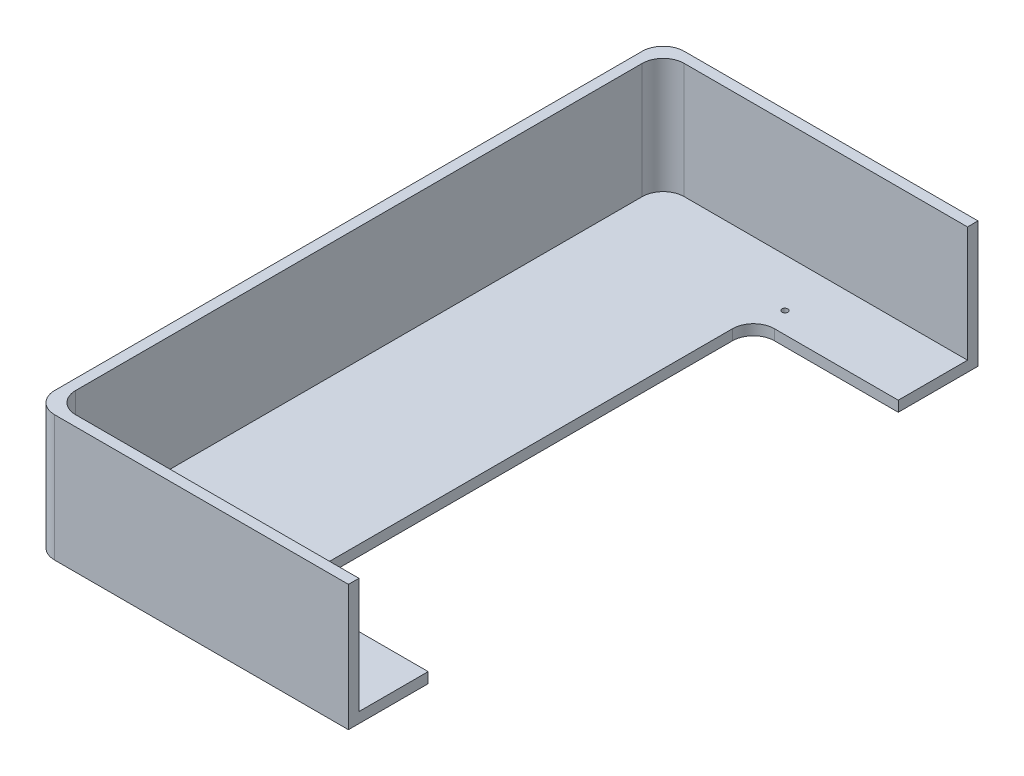
ISO-10303-21;
HEADER;
FILE_DESCRIPTION(('STEP AP214'),'2;1');
FILE_NAME('part.step','',(''),(''),'','','');
FILE_SCHEMA(('AUTOMOTIVE_DESIGN { 1 0 10303 214 1 1 1 1 }'));
ENDSEC;
DATA;
#1=APPLICATION_CONTEXT('core data for automotive mechanical design processes');
#2=APPLICATION_PROTOCOL_DEFINITION('international standard','automotive_design',2000,#1);
#3=PRODUCT_CONTEXT('',#1,'mechanical');
#4=PRODUCT('Part','Part','',(#3));
#5=PRODUCT_RELATED_PRODUCT_CATEGORY('part','',(#4));
#6=PRODUCT_DEFINITION_FORMATION('','',#4);
#7=PRODUCT_DEFINITION_CONTEXT('part definition',#1,'design');
#8=PRODUCT_DEFINITION('design','',#6,#7);
#9=PRODUCT_DEFINITION_SHAPE('','',#8);
#10=(LENGTH_UNIT() NAMED_UNIT(*) SI_UNIT(.MILLI.,.METRE.));
#11=(NAMED_UNIT(*) PLANE_ANGLE_UNIT() SI_UNIT($,.RADIAN.));
#12=(NAMED_UNIT(*) SI_UNIT($,.STERADIAN.) SOLID_ANGLE_UNIT());
#13=UNCERTAINTY_MEASURE_WITH_UNIT(LENGTH_MEASURE(1.E-05),#10,'distance_accuracy_value','');
#14=(GEOMETRIC_REPRESENTATION_CONTEXT(3) GLOBAL_UNCERTAINTY_ASSIGNED_CONTEXT((#13)) GLOBAL_UNIT_ASSIGNED_CONTEXT((#10,
#11,#12)) REPRESENTATION_CONTEXT('',''));
#15=CARTESIAN_POINT('',(0.,0.,0.));
#16=DIRECTION('',(0.,0.,1.));
#17=DIRECTION('',(1.,0.,0.));
#18=AXIS2_PLACEMENT_3D('',#15,#16,#17);
#19=CARTESIAN_POINT('',(0.,60.,0.));
#20=DIRECTION('',(-1.,0.,0.));
#21=DIRECTION('',(0.,0.,1.));
#22=AXIS2_PLACEMENT_3D('',#19,#20,#21);
#23=PLANE('',#22);
#24=DIRECTION('',(0.,0.,-1.));
#25=VECTOR('',#24,1.);
#26=CARTESIAN_POINT('',(0.,5.,5.));
#27=LINE('',#26,#25);
#28=CARTESIAN_POINT('',(0.,5.,38.));
#29=VERTEX_POINT('',#28);
#30=CARTESIAN_POINT('',(0.,5.,5.));
#31=VERTEX_POINT('',#30);
#32=EDGE_CURVE('E206',#29,#31,#27,.T.);
#33=ORIENTED_EDGE('',*,*,#32,.F.);
#34=DIRECTION('',(0.,1.,0.));
#35=VECTOR('',#34,1.);
#36=CARTESIAN_POINT('',(0.,-234.386433054475,38.));
#37=LINE('',#36,#35);
#38=CARTESIAN_POINT('',(0.,0.,38.));
#39=VERTEX_POINT('',#38);
#40=EDGE_CURVE('E196',#39,#29,#37,.T.);
#41=ORIENTED_EDGE('',*,*,#40,.F.);
#42=DIRECTION('',(0.,0.,-1.));
#43=VECTOR('',#42,1.);
#44=CARTESIAN_POINT('',(0.,0.,0.));
#45=LINE('',#44,#43);
#46=CARTESIAN_POINT('',(0.,0.,0.));
#47=VERTEX_POINT('',#46);
#48=EDGE_CURVE('E228',#39,#47,#45,.T.);
#49=ORIENTED_EDGE('',*,*,#48,.T.);
#50=DIRECTION('',(0.,-1.,0.));
#51=VECTOR('',#50,1.);
#52=CARTESIAN_POINT('',(0.,60.,0.));
#53=LINE('',#52,#51);
#54=CARTESIAN_POINT('',(0.,60.,0.));
#55=VERTEX_POINT('',#54);
#56=EDGE_CURVE('E259',#55,#47,#53,.T.);
#57=ORIENTED_EDGE('',*,*,#56,.F.);
#58=DIRECTION('',(0.,0.,-1.));
#59=VECTOR('',#58,1.);
#60=CARTESIAN_POINT('',(0.,60.,0.));
#61=LINE('',#60,#59);
#62=CARTESIAN_POINT('',(0.,60.,5.));
#63=VERTEX_POINT('',#62);
#64=EDGE_CURVE('E234',#63,#55,#61,.T.);
#65=ORIENTED_EDGE('',*,*,#64,.F.);
#66=DIRECTION('',(0.,1.,0.));
#67=VECTOR('',#66,1.);
#68=CARTESIAN_POINT('',(0.,-324.22985673747,5.));
#69=LINE('',#68,#67);
#70=EDGE_CURVE('E205',#31,#63,#69,.T.);
#71=ORIENTED_EDGE('',*,*,#70,.F.);
#72=EDGE_LOOP('',(#33,#41,#49,#57,#65,#71));
#73=FACE_BOUND('',#72,.T.);
#74=ADVANCED_FACE('F45',(#73),#23,.F.);
#75=CARTESIAN_POINT('',(0.,0.,300.));
#76=VERTEX_POINT('',#75);
#77=CARTESIAN_POINT('',(0.,0.,262.));
#78=VERTEX_POINT('',#77);
#79=EDGE_CURVE('E194',#76,#78,#45,.T.);
#80=ORIENTED_EDGE('',*,*,#79,.T.);
#81=DIRECTION('',(0.,1.,0.));
#82=VECTOR('',#81,1.);
#83=CARTESIAN_POINT('',(0.,-234.386433054475,262.));
#84=LINE('',#83,#82);
#85=CARTESIAN_POINT('',(0.,5.,262.));
#86=VERTEX_POINT('',#85);
#87=EDGE_CURVE('E177',#78,#86,#84,.T.);
#88=ORIENTED_EDGE('',*,*,#87,.T.);
#89=CARTESIAN_POINT('',(0.,5.,295.));
#90=VERTEX_POINT('',#89);
#91=EDGE_CURVE('E191',#90,#86,#27,.T.);
#92=ORIENTED_EDGE('',*,*,#91,.F.);
#93=DIRECTION('',(0.,1.,0.));
#94=VECTOR('',#93,1.);
#95=CARTESIAN_POINT('',(0.,-324.22985673747,295.));
#96=LINE('',#95,#94);
#97=CARTESIAN_POINT('',(0.,60.,295.));
#98=VERTEX_POINT('',#97);
#99=EDGE_CURVE('E219',#90,#98,#96,.T.);
#100=ORIENTED_EDGE('',*,*,#99,.T.);
#101=CARTESIAN_POINT('',(0.,60.,300.));
#102=VERTEX_POINT('',#101);
#103=EDGE_CURVE('E229',#102,#98,#61,.T.);
#104=ORIENTED_EDGE('',*,*,#103,.F.);
#105=DIRECTION('',(0.,-1.,0.));
#106=VECTOR('',#105,1.);
#107=CARTESIAN_POINT('',(0.,60.,300.));
#108=LINE('',#107,#106);
#109=EDGE_CURVE('E244',#102,#76,#108,.T.);
#110=ORIENTED_EDGE('',*,*,#109,.T.);
#111=EDGE_LOOP('',(#80,#88,#92,#100,#104,#110));
#112=FACE_BOUND('',#111,.T.);
#113=ADVANCED_FACE('F189',(#112),#23,.F.);
#114=CARTESIAN_POINT('',(0.,60.,0.));
#115=DIRECTION('',(0.,0.,1.));
#116=DIRECTION('',(1.,0.,0.));
#117=AXIS2_PLACEMENT_3D('',#114,#115,#116);
#118=PLANE('',#117);
#119=DIRECTION('',(-1.,0.,0.));
#120=VECTOR('',#119,1.);
#121=CARTESIAN_POINT('',(0.,0.,0.));
#122=LINE('',#121,#120);
#123=CARTESIAN_POINT('',(-140.,0.,0.));
#124=VERTEX_POINT('',#123);
#125=EDGE_CURVE('E247',#47,#124,#122,.T.);
#126=ORIENTED_EDGE('',*,*,#125,.T.);
#127=DIRECTION('',(0.,-1.,0.));
#128=VECTOR('',#127,1.);
#129=CARTESIAN_POINT('',(-140.,60.,0.));
#130=LINE('',#129,#128);
#131=CARTESIAN_POINT('',(-140.,60.,0.));
#132=VERTEX_POINT('',#131);
#133=EDGE_CURVE('E61',#124,#132,#130,.F.);
#134=ORIENTED_EDGE('',*,*,#133,.T.);
#135=DIRECTION('',(-1.,0.,0.));
#136=VECTOR('',#135,1.);
#137=CARTESIAN_POINT('',(0.,60.,0.));
#138=LINE('',#137,#136);
#139=EDGE_CURVE('E233',#55,#132,#138,.T.);
#140=ORIENTED_EDGE('',*,*,#139,.F.);
#141=ORIENTED_EDGE('',*,*,#56,.T.);
#142=EDGE_LOOP('',(#126,#134,#140,#141));
#143=FACE_BOUND('',#142,.T.);
#144=ADVANCED_FACE('F429',(#143),#118,.F.);
#145=CARTESIAN_POINT('',(-150.,60.,0.));
#146=DIRECTION('',(1.,0.,0.));
#147=DIRECTION('',(0.,0.,-1.));
#148=AXIS2_PLACEMENT_3D('',#145,#146,#147);
#149=PLANE('',#148);
#150=DIRECTION('',(0.,0.,1.));
#151=VECTOR('',#150,1.);
#152=CARTESIAN_POINT('',(-150.,0.,0.));
#153=LINE('',#152,#151);
#154=CARTESIAN_POINT('',(-150.,0.,10.));
#155=VERTEX_POINT('',#154);
#156=CARTESIAN_POINT('',(-150.,0.,290.));
#157=VERTEX_POINT('',#156);
#158=EDGE_CURVE('E250',#155,#157,#153,.T.);
#159=ORIENTED_EDGE('',*,*,#158,.T.);
#160=DIRECTION('',(0.,-1.,0.));
#161=VECTOR('',#160,1.);
#162=CARTESIAN_POINT('',(-150.,60.,290.));
#163=LINE('',#162,#161);
#164=CARTESIAN_POINT('',(-150.,60.,290.));
#165=VERTEX_POINT('',#164);
#166=EDGE_CURVE('E303',#157,#165,#163,.F.);
#167=ORIENTED_EDGE('',*,*,#166,.T.);
#168=DIRECTION('',(0.,0.,1.));
#169=VECTOR('',#168,1.);
#170=CARTESIAN_POINT('',(-150.,60.,0.));
#171=LINE('',#170,#169);
#172=CARTESIAN_POINT('',(-150.,60.,10.));
#173=VERTEX_POINT('',#172);
#174=EDGE_CURVE('E237',#173,#165,#171,.T.);
#175=ORIENTED_EDGE('',*,*,#174,.F.);
#176=DIRECTION('',(0.,-1.,0.));
#177=VECTOR('',#176,1.);
#178=CARTESIAN_POINT('',(-150.,60.,10.));
#179=LINE('',#178,#177);
#180=EDGE_CURVE('E299',#173,#155,#179,.T.);
#181=ORIENTED_EDGE('',*,*,#180,.T.);
#182=EDGE_LOOP('',(#159,#167,#175,#181));
#183=FACE_BOUND('',#182,.T.);
#184=ADVANCED_FACE('F433',(#183),#149,.F.);
#185=CARTESIAN_POINT('',(0.,60.,300.));
#186=DIRECTION('',(0.,0.,-1.));
#187=DIRECTION('',(-1.,0.,0.));
#188=AXIS2_PLACEMENT_3D('',#185,#186,#187);
#189=PLANE('',#188);
#190=DIRECTION('',(1.,0.,0.));
#191=VECTOR('',#190,1.);
#192=CARTESIAN_POINT('',(0.,60.,300.));
#193=LINE('',#192,#191);
#194=CARTESIAN_POINT('',(-140.,60.,300.));
#195=VERTEX_POINT('',#194);
#196=EDGE_CURVE('E241',#195,#102,#193,.T.);
#197=ORIENTED_EDGE('',*,*,#196,.F.);
#198=DIRECTION('',(0.,-1.,0.));
#199=VECTOR('',#198,1.);
#200=CARTESIAN_POINT('',(-140.,60.,300.));
#201=LINE('',#200,#199);
#202=CARTESIAN_POINT('',(-140.,0.,300.));
#203=VERTEX_POINT('',#202);
#204=EDGE_CURVE('E289',#195,#203,#201,.T.);
#205=ORIENTED_EDGE('',*,*,#204,.T.);
#206=DIRECTION('',(1.,0.,0.));
#207=VECTOR('',#206,1.);
#208=CARTESIAN_POINT('',(0.,0.,300.));
#209=LINE('',#208,#207);
#210=EDGE_CURVE('E254',#203,#76,#209,.T.);
#211=ORIENTED_EDGE('',*,*,#210,.T.);
#212=ORIENTED_EDGE('',*,*,#109,.F.);
#213=EDGE_LOOP('',(#197,#205,#211,#212));
#214=FACE_BOUND('',#213,.T.);
#215=ADVANCED_FACE('F408',(#214),#189,.F.);
#216=CARTESIAN_POINT('',(0.,60.,0.));
#217=DIRECTION('',(0.,-1.,0.));
#218=DIRECTION('',(0.,0.,-1.));
#219=AXIS2_PLACEMENT_3D('',#216,#217,#218);
#220=PLANE('',#219);
#221=ORIENTED_EDGE('',*,*,#174,.T.);
#222=CARTESIAN_POINT('',(-140.,60.,290.));
#223=DIRECTION('',(0.,-1.,0.));
#224=DIRECTION('',(0.,0.,-1.));
#225=AXIS2_PLACEMENT_3D('',#222,#223,#224);
#226=CIRCLE('',#225,10.);
#227=EDGE_CURVE('E309',#165,#195,#226,.F.);
#228=ORIENTED_EDGE('',*,*,#227,.T.);
#229=ORIENTED_EDGE('',*,*,#196,.T.);
#230=ORIENTED_EDGE('',*,*,#103,.T.);
#231=DIRECTION('',(1.,0.,0.));
#232=VECTOR('',#231,1.);
#233=CARTESIAN_POINT('',(-145.,60.,295.));
#234=LINE('',#233,#232);
#235=CARTESIAN_POINT('',(-135.,60.,295.));
#236=VERTEX_POINT('',#235);
#237=EDGE_CURVE('E376',#236,#98,#234,.T.);
#238=ORIENTED_EDGE('',*,*,#237,.F.);
#239=CARTESIAN_POINT('',(-135.,60.,285.));
#240=DIRECTION('',(0.,-1.,0.));
#241=DIRECTION('',(0.,0.,-1.));
#242=AXIS2_PLACEMENT_3D('',#239,#240,#241);
#243=CIRCLE('',#242,10.);
#244=CARTESIAN_POINT('',(-145.,60.,285.));
#245=VERTEX_POINT('',#244);
#246=EDGE_CURVE('E326',#236,#245,#243,.T.);
#247=ORIENTED_EDGE('',*,*,#246,.T.);
#248=DIRECTION('',(0.,0.,1.));
#249=VECTOR('',#248,1.);
#250=CARTESIAN_POINT('',(-145.,60.,5.));
#251=LINE('',#250,#249);
#252=CARTESIAN_POINT('',(-145.,60.,15.));
#253=VERTEX_POINT('',#252);
#254=EDGE_CURVE('E212',#253,#245,#251,.T.);
#255=ORIENTED_EDGE('',*,*,#254,.F.);
#256=CARTESIAN_POINT('',(-135.,60.,15.));
#257=DIRECTION('',(0.,-1.,0.));
#258=DIRECTION('',(0.,0.,-1.));
#259=AXIS2_PLACEMENT_3D('',#256,#257,#258);
#260=CIRCLE('',#259,10.);
#261=CARTESIAN_POINT('',(-135.,60.,5.));
#262=VERTEX_POINT('',#261);
#263=EDGE_CURVE('E12',#253,#262,#260,.T.);
#264=ORIENTED_EDGE('',*,*,#263,.T.);
#265=DIRECTION('',(-1.,0.,0.));
#266=VECTOR('',#265,1.);
#267=CARTESIAN_POINT('',(-5.,60.,5.));
#268=LINE('',#267,#266);
#269=EDGE_CURVE('E215',#63,#262,#268,.T.);
#270=ORIENTED_EDGE('',*,*,#269,.F.);
#271=ORIENTED_EDGE('',*,*,#64,.T.);
#272=ORIENTED_EDGE('',*,*,#139,.T.);
#273=CARTESIAN_POINT('',(-140.,60.,10.));
#274=DIRECTION('',(0.,-1.,0.));
#275=DIRECTION('',(0.,0.,-1.));
#276=AXIS2_PLACEMENT_3D('',#273,#274,#275);
#277=CIRCLE('',#276,10.);
#278=EDGE_CURVE('E306',#132,#173,#277,.F.);
#279=ORIENTED_EDGE('',*,*,#278,.T.);
#280=EDGE_LOOP('',(#221,#228,#229,#230,#238,#247,#255,#264,#270,#271,#272,#279));
#281=FACE_BOUND('',#280,.T.);
#282=ADVANCED_FACE('F402',(#281),#220,.F.);
#283=CARTESIAN_POINT('',(0.,0.,0.));
#284=DIRECTION('',(0.,-1.,0.));
#285=DIRECTION('',(0.,0.,-1.));
#286=AXIS2_PLACEMENT_3D('',#283,#284,#285);
#287=PLANE('',#286);
#288=CARTESIAN_POINT('',(-64.,0.,28.));
#289=DIRECTION('',(0.,-1.,0.));
#290=DIRECTION('',(0.,0.,-1.));
#291=AXIS2_PLACEMENT_3D('',#288,#289,#290);
#292=CIRCLE('',#291,1.4);
#293=CARTESIAN_POINT('',(-64.,0.,26.6));
#294=VERTEX_POINT('',#293);
#295=EDGE_CURVE('E361',#294,#294,#292,.F.);
#296=ORIENTED_EDGE('',*,*,#295,.T.);
#297=EDGE_LOOP('',(#296));
#298=FACE_BOUND('',#297,.T.);
#299=CARTESIAN_POINT('',(-64.,0.,272.));
#300=DIRECTION('',(0.,-1.,0.));
#301=DIRECTION('',(0.,0.,-1.));
#302=AXIS2_PLACEMENT_3D('',#299,#300,#301);
#303=CIRCLE('',#302,1.40000000000002);
#304=CARTESIAN_POINT('',(-64.,0.,270.6));
#305=VERTEX_POINT('',#304);
#306=EDGE_CURVE('E469',#305,#305,#303,.F.);
#307=ORIENTED_EDGE('',*,*,#306,.T.);
#308=EDGE_LOOP('',(#307));
#309=FACE_BOUND('',#308,.T.);
#310=ORIENTED_EDGE('',*,*,#210,.F.);
#311=CARTESIAN_POINT('',(-140.,0.,290.));
#312=DIRECTION('',(0.,-1.,0.));
#313=DIRECTION('',(0.,0.,-1.));
#314=AXIS2_PLACEMENT_3D('',#311,#312,#313);
#315=CIRCLE('',#314,10.);
#316=EDGE_CURVE('E296',#203,#157,#315,.T.);
#317=ORIENTED_EDGE('',*,*,#316,.T.);
#318=ORIENTED_EDGE('',*,*,#158,.F.);
#319=CARTESIAN_POINT('',(-140.,0.,10.));
#320=DIRECTION('',(0.,-1.,0.));
#321=DIRECTION('',(0.,0.,-1.));
#322=AXIS2_PLACEMENT_3D('',#319,#320,#321);
#323=CIRCLE('',#322,10.);
#324=EDGE_CURVE('E293',#155,#124,#323,.T.);
#325=ORIENTED_EDGE('',*,*,#324,.T.);
#326=ORIENTED_EDGE('',*,*,#125,.F.);
#327=ORIENTED_EDGE('',*,*,#48,.F.);
#328=DIRECTION('',(-1.,0.,0.));
#329=VECTOR('',#328,1.);
#330=CARTESIAN_POINT('',(0.,0.,38.));
#331=LINE('',#330,#329);
#332=CARTESIAN_POINT('',(-59.,0.,38.));
#333=VERTEX_POINT('',#332);
#334=EDGE_CURVE('E184',#39,#333,#331,.T.);
#335=ORIENTED_EDGE('',*,*,#334,.T.);
#336=CARTESIAN_POINT('',(-59.,0.,48.));
#337=DIRECTION('',(0.,-1.,0.));
#338=DIRECTION('',(0.,0.,-1.));
#339=AXIS2_PLACEMENT_3D('',#336,#337,#338);
#340=CIRCLE('',#339,10.);
#341=CARTESIAN_POINT('',(-69.,0.,48.));
#342=VERTEX_POINT('',#341);
#343=EDGE_CURVE('E54',#333,#342,#340,.F.);
#344=ORIENTED_EDGE('',*,*,#343,.T.);
#345=DIRECTION('',(0.,0.,1.));
#346=VECTOR('',#345,1.);
#347=CARTESIAN_POINT('',(-69.,0.,38.));
#348=LINE('',#347,#346);
#349=CARTESIAN_POINT('',(-69.,0.,252.));
#350=VERTEX_POINT('',#349);
#351=EDGE_CURVE('E339',#342,#350,#348,.T.);
#352=ORIENTED_EDGE('',*,*,#351,.T.);
#353=CARTESIAN_POINT('',(-59.,0.,252.));
#354=DIRECTION('',(0.,-1.,0.));
#355=DIRECTION('',(0.,0.,-1.));
#356=AXIS2_PLACEMENT_3D('',#353,#354,#355);
#357=CIRCLE('',#356,10.);
#358=CARTESIAN_POINT('',(-59.,0.,262.));
#359=VERTEX_POINT('',#358);
#360=EDGE_CURVE('E323',#350,#359,#357,.F.);
#361=ORIENTED_EDGE('',*,*,#360,.T.);
#362=DIRECTION('',(1.,0.,0.));
#363=VECTOR('',#362,1.);
#364=CARTESIAN_POINT('',(0.,0.,262.));
#365=LINE('',#364,#363);
#366=EDGE_CURVE('E197',#359,#78,#365,.T.);
#367=ORIENTED_EDGE('',*,*,#366,.T.);
#368=ORIENTED_EDGE('',*,*,#79,.F.);
#369=EDGE_LOOP('',(#310,#317,#318,#325,#326,#327,#335,#344,#352,#361,#367,#368));
#370=FACE_BOUND('',#369,.T.);
#371=ADVANCED_FACE('F338',(#298,#309,#370),#287,.T.);
#372=CARTESIAN_POINT('',(0.,5.,0.));
#373=DIRECTION('',(0.,-1.,0.));
#374=DIRECTION('',(0.,0.,-1.));
#375=AXIS2_PLACEMENT_3D('',#372,#373,#374);
#376=PLANE('',#375);
#377=CARTESIAN_POINT('',(-64.,5.,28.));
#378=DIRECTION('',(0.,1.,0.));
#379=DIRECTION('',(0.,0.,1.));
#380=AXIS2_PLACEMENT_3D('',#377,#378,#379);
#381=CIRCLE('',#380,1.4);
#382=CARTESIAN_POINT('',(-64.,5.,29.4));
#383=VERTEX_POINT('',#382);
#384=EDGE_CURVE('E367',#383,#383,#381,.T.);
#385=ORIENTED_EDGE('',*,*,#384,.F.);
#386=EDGE_LOOP('',(#385));
#387=FACE_BOUND('',#386,.T.);
#388=CARTESIAN_POINT('',(-64.,5.,272.));
#389=DIRECTION('',(0.,1.,0.));
#390=DIRECTION('',(0.,0.,-1.));
#391=AXIS2_PLACEMENT_3D('',#388,#389,#390);
#392=CIRCLE('',#391,1.40000000000002);
#393=CARTESIAN_POINT('',(-64.,5.,270.6));
#394=VERTEX_POINT('',#393);
#395=EDGE_CURVE('E466',#394,#394,#392,.T.);
#396=ORIENTED_EDGE('',*,*,#395,.F.);
#397=EDGE_LOOP('',(#396));
#398=FACE_BOUND('',#397,.T.);
#399=DIRECTION('',(0.,0.,1.));
#400=VECTOR('',#399,1.);
#401=CARTESIAN_POINT('',(-145.,5.,5.));
#402=LINE('',#401,#400);
#403=CARTESIAN_POINT('',(-145.,5.,15.));
#404=VERTEX_POINT('',#403);
#405=CARTESIAN_POINT('',(-145.,5.,285.));
#406=VERTEX_POINT('',#405);
#407=EDGE_CURVE('E220',#404,#406,#402,.T.);
#408=ORIENTED_EDGE('',*,*,#407,.T.);
#409=CARTESIAN_POINT('',(-135.,5.,285.));
#410=DIRECTION('',(0.,-1.,0.));
#411=DIRECTION('',(0.,0.,-1.));
#412=AXIS2_PLACEMENT_3D('',#409,#410,#411);
#413=CIRCLE('',#412,10.);
#414=CARTESIAN_POINT('',(-135.,5.,295.));
#415=VERTEX_POINT('',#414);
#416=EDGE_CURVE('E286',#406,#415,#413,.F.);
#417=ORIENTED_EDGE('',*,*,#416,.T.);
#418=DIRECTION('',(1.,0.,0.));
#419=VECTOR('',#418,1.);
#420=CARTESIAN_POINT('',(-145.,5.,295.));
#421=LINE('',#420,#419);
#422=EDGE_CURVE('E202',#415,#90,#421,.T.);
#423=ORIENTED_EDGE('',*,*,#422,.T.);
#424=ORIENTED_EDGE('',*,*,#91,.T.);
#425=DIRECTION('',(1.,0.,0.));
#426=VECTOR('',#425,1.);
#427=CARTESIAN_POINT('',(0.,5.,262.));
#428=LINE('',#427,#426);
#429=CARTESIAN_POINT('',(-59.,5.,262.));
#430=VERTEX_POINT('',#429);
#431=EDGE_CURVE('E173',#430,#86,#428,.T.);
#432=ORIENTED_EDGE('',*,*,#431,.F.);
#433=CARTESIAN_POINT('',(-59.,5.,252.));
#434=DIRECTION('',(0.,-1.,0.));
#435=DIRECTION('',(0.,0.,-1.));
#436=AXIS2_PLACEMENT_3D('',#433,#434,#435);
#437=CIRCLE('',#436,10.);
#438=CARTESIAN_POINT('',(-69.,5.,252.));
#439=VERTEX_POINT('',#438);
#440=EDGE_CURVE('E320',#430,#439,#437,.T.);
#441=ORIENTED_EDGE('',*,*,#440,.T.);
#442=DIRECTION('',(0.,0.,1.));
#443=VECTOR('',#442,1.);
#444=CARTESIAN_POINT('',(-69.,5.,38.));
#445=LINE('',#444,#443);
#446=CARTESIAN_POINT('',(-69.,5.,48.));
#447=VERTEX_POINT('',#446);
#448=EDGE_CURVE('E185',#447,#439,#445,.T.);
#449=ORIENTED_EDGE('',*,*,#448,.F.);
#450=CARTESIAN_POINT('',(-59.,5.,48.));
#451=DIRECTION('',(0.,-1.,0.));
#452=DIRECTION('',(0.,0.,-1.));
#453=AXIS2_PLACEMENT_3D('',#450,#451,#452);
#454=CIRCLE('',#453,10.);
#455=CARTESIAN_POINT('',(-59.,5.,38.));
#456=VERTEX_POINT('',#455);
#457=EDGE_CURVE('E329',#447,#456,#454,.T.);
#458=ORIENTED_EDGE('',*,*,#457,.T.);
#459=DIRECTION('',(-1.,0.,0.));
#460=VECTOR('',#459,1.);
#461=CARTESIAN_POINT('',(0.,5.,38.));
#462=LINE('',#461,#460);
#463=EDGE_CURVE('E355',#29,#456,#462,.T.);
#464=ORIENTED_EDGE('',*,*,#463,.F.);
#465=ORIENTED_EDGE('',*,*,#32,.T.);
#466=DIRECTION('',(-1.,0.,0.));
#467=VECTOR('',#466,1.);
#468=CARTESIAN_POINT('',(-5.,5.,5.));
#469=LINE('',#468,#467);
#470=CARTESIAN_POINT('',(-135.,5.,5.));
#471=VERTEX_POINT('',#470);
#472=EDGE_CURVE('E210',#31,#471,#469,.T.);
#473=ORIENTED_EDGE('',*,*,#472,.T.);
#474=CARTESIAN_POINT('',(-135.,5.,15.));
#475=DIRECTION('',(0.,-1.,0.));
#476=DIRECTION('',(0.,0.,-1.));
#477=AXIS2_PLACEMENT_3D('',#474,#475,#476);
#478=CIRCLE('',#477,10.);
#479=EDGE_CURVE('E283',#471,#404,#478,.F.);
#480=ORIENTED_EDGE('',*,*,#479,.T.);
#481=EDGE_LOOP('',(#408,#417,#423,#424,#432,#441,#449,#458,#464,#465,#473,#480));
#482=FACE_BOUND('',#481,.T.);
#483=ADVANCED_FACE('F200',(#387,#398,#482),#376,.F.);
#484=CARTESIAN_POINT('',(-5.,-324.22985673747,5.));
#485=DIRECTION('',(0.,0.,-1.));
#486=DIRECTION('',(-1.,0.,0.));
#487=AXIS2_PLACEMENT_3D('',#484,#485,#486);
#488=PLANE('',#487);
#489=ORIENTED_EDGE('',*,*,#269,.T.);
#490=DIRECTION('',(0.,1.,0.));
#491=VECTOR('',#490,1.);
#492=CARTESIAN_POINT('',(-135.,5.,5.));
#493=LINE('',#492,#491);
#494=EDGE_CURVE('E317',#262,#471,#493,.F.);
#495=ORIENTED_EDGE('',*,*,#494,.T.);
#496=ORIENTED_EDGE('',*,*,#472,.F.);
#497=ORIENTED_EDGE('',*,*,#70,.T.);
#498=EDGE_LOOP('',(#489,#495,#496,#497));
#499=FACE_BOUND('',#498,.T.);
#500=ADVANCED_FACE('F385',(#499),#488,.F.);
#501=CARTESIAN_POINT('',(-145.,-324.22985673747,5.));
#502=DIRECTION('',(-1.,0.,0.));
#503=DIRECTION('',(0.,0.,1.));
#504=AXIS2_PLACEMENT_3D('',#501,#502,#503);
#505=PLANE('',#504);
#506=ORIENTED_EDGE('',*,*,#254,.T.);
#507=DIRECTION('',(0.,1.,0.));
#508=VECTOR('',#507,1.);
#509=CARTESIAN_POINT('',(-145.,5.,285.));
#510=LINE('',#509,#508);
#511=EDGE_CURVE('E280',#245,#406,#510,.F.);
#512=ORIENTED_EDGE('',*,*,#511,.T.);
#513=ORIENTED_EDGE('',*,*,#407,.F.);
#514=DIRECTION('',(0.,1.,0.));
#515=VECTOR('',#514,1.);
#516=CARTESIAN_POINT('',(-145.,60.,15.));
#517=LINE('',#516,#515);
#518=EDGE_CURVE('E276',#404,#253,#517,.T.);
#519=ORIENTED_EDGE('',*,*,#518,.T.);
#520=EDGE_LOOP('',(#506,#512,#513,#519));
#521=FACE_BOUND('',#520,.T.);
#522=ADVANCED_FACE('F394',(#521),#505,.F.);
#523=CARTESIAN_POINT('',(-145.,-324.22985673747,295.));
#524=DIRECTION('',(0.,0.,1.));
#525=DIRECTION('',(1.,0.,0.));
#526=AXIS2_PLACEMENT_3D('',#523,#524,#525);
#527=PLANE('',#526);
#528=ORIENTED_EDGE('',*,*,#422,.F.);
#529=DIRECTION('',(0.,1.,0.));
#530=VECTOR('',#529,1.);
#531=CARTESIAN_POINT('',(-135.,60.,295.));
#532=LINE('',#531,#530);
#533=EDGE_CURVE('E272',#415,#236,#532,.T.);
#534=ORIENTED_EDGE('',*,*,#533,.T.);
#535=ORIENTED_EDGE('',*,*,#237,.T.);
#536=ORIENTED_EDGE('',*,*,#99,.F.);
#537=EDGE_LOOP('',(#528,#534,#535,#536));
#538=FACE_BOUND('',#537,.T.);
#539=ADVANCED_FACE('F399',(#538),#527,.F.);
#540=CARTESIAN_POINT('',(0.,-234.386433054475,38.));
#541=DIRECTION('',(0.,0.,-1.));
#542=DIRECTION('',(-1.,0.,0.));
#543=AXIS2_PLACEMENT_3D('',#540,#541,#542);
#544=PLANE('',#543);
#545=ORIENTED_EDGE('',*,*,#463,.T.);
#546=DIRECTION('',(0.,1.,0.));
#547=VECTOR('',#546,1.);
#548=CARTESIAN_POINT('',(-59.,0.,38.));
#549=LINE('',#548,#547);
#550=EDGE_CURVE('E312',#456,#333,#549,.F.);
#551=ORIENTED_EDGE('',*,*,#550,.T.);
#552=ORIENTED_EDGE('',*,*,#334,.F.);
#553=ORIENTED_EDGE('',*,*,#40,.T.);
#554=EDGE_LOOP('',(#545,#551,#552,#553));
#555=FACE_BOUND('',#554,.T.);
#556=ADVANCED_FACE('F358',(#555),#544,.F.);
#557=CARTESIAN_POINT('',(-69.,-234.386433054475,38.));
#558=DIRECTION('',(-1.,0.,0.));
#559=DIRECTION('',(0.,0.,1.));
#560=AXIS2_PLACEMENT_3D('',#557,#558,#559);
#561=PLANE('',#560);
#562=ORIENTED_EDGE('',*,*,#448,.T.);
#563=DIRECTION('',(0.,1.,0.));
#564=VECTOR('',#563,1.);
#565=CARTESIAN_POINT('',(-69.,0.,252.));
#566=LINE('',#565,#564);
#567=EDGE_CURVE('E269',#439,#350,#566,.F.);
#568=ORIENTED_EDGE('',*,*,#567,.T.);
#569=ORIENTED_EDGE('',*,*,#351,.F.);
#570=DIRECTION('',(0.,1.,0.));
#571=VECTOR('',#570,1.);
#572=CARTESIAN_POINT('',(-69.,5.,48.));
#573=LINE('',#572,#571);
#574=EDGE_CURVE('E265',#342,#447,#573,.T.);
#575=ORIENTED_EDGE('',*,*,#574,.T.);
#576=EDGE_LOOP('',(#562,#568,#569,#575));
#577=FACE_BOUND('',#576,.T.);
#578=ADVANCED_FACE('F347',(#577),#561,.F.);
#579=CARTESIAN_POINT('',(0.,-234.386433054475,262.));
#580=DIRECTION('',(0.,0.,1.));
#581=DIRECTION('',(1.,0.,0.));
#582=AXIS2_PLACEMENT_3D('',#579,#580,#581);
#583=PLANE('',#582);
#584=ORIENTED_EDGE('',*,*,#366,.F.);
#585=DIRECTION('',(0.,1.,0.));
#586=VECTOR('',#585,1.);
#587=CARTESIAN_POINT('',(-59.,5.,262.));
#588=LINE('',#587,#586);
#589=EDGE_CURVE('E180',#359,#430,#588,.T.);
#590=ORIENTED_EDGE('',*,*,#589,.T.);
#591=ORIENTED_EDGE('',*,*,#431,.T.);
#592=ORIENTED_EDGE('',*,*,#87,.F.);
#593=EDGE_LOOP('',(#584,#590,#591,#592));
#594=FACE_BOUND('',#593,.T.);
#595=ADVANCED_FACE('F176',(#594),#583,.F.);
#596=CARTESIAN_POINT('',(-64.,-3.95979797464472,272.));
#597=DIRECTION('',(0.,1.,0.));
#598=DIRECTION('',(0.,0.,1.));
#599=AXIS2_PLACEMENT_3D('',#596,#597,#598);
#600=CYLINDRICAL_SURFACE('',#599,1.40000000000002);
#601=ORIENTED_EDGE('',*,*,#395,.T.);
#602=EDGE_LOOP('',(#601));
#603=FACE_BOUND('',#602,.T.);
#604=ORIENTED_EDGE('',*,*,#306,.F.);
#605=EDGE_LOOP('',(#604));
#606=FACE_BOUND('',#605,.T.);
#607=ADVANCED_FACE('F420',(#603,#606),#600,.F.);
#608=CARTESIAN_POINT('',(-64.,-3.95979797464472,28.));
#609=DIRECTION('',(0.,1.,0.));
#610=DIRECTION('',(0.,0.,1.));
#611=AXIS2_PLACEMENT_3D('',#608,#609,#610);
#612=CYLINDRICAL_SURFACE('',#611,1.4);
#613=ORIENTED_EDGE('',*,*,#384,.T.);
#614=EDGE_LOOP('',(#613));
#615=FACE_BOUND('',#614,.T.);
#616=ORIENTED_EDGE('',*,*,#295,.F.);
#617=EDGE_LOOP('',(#616));
#618=FACE_BOUND('',#617,.T.);
#619=ADVANCED_FACE('F412',(#615,#618),#612,.F.);
#620=CARTESIAN_POINT('',(-59.,-234.386433054475,252.));
#621=DIRECTION('',(0.,-1.,0.));
#622=DIRECTION('',(0.,0.,-1.));
#623=AXIS2_PLACEMENT_3D('',#620,#621,#622);
#624=CYLINDRICAL_SURFACE('',#623,10.);
#625=ORIENTED_EDGE('',*,*,#360,.F.);
#626=ORIENTED_EDGE('',*,*,#567,.F.);
#627=ORIENTED_EDGE('',*,*,#440,.F.);
#628=ORIENTED_EDGE('',*,*,#589,.F.);
#629=EDGE_LOOP('',(#625,#626,#627,#628));
#630=FACE_BOUND('',#629,.T.);
#631=ADVANCED_FACE('F410',(#630),#624,.F.);
#632=CARTESIAN_POINT('',(-135.,-324.22985673747,285.));
#633=DIRECTION('',(0.,-1.,0.));
#634=DIRECTION('',(0.,0.,-1.));
#635=AXIS2_PLACEMENT_3D('',#632,#633,#634);
#636=CYLINDRICAL_SURFACE('',#635,10.);
#637=ORIENTED_EDGE('',*,*,#416,.F.);
#638=ORIENTED_EDGE('',*,*,#511,.F.);
#639=ORIENTED_EDGE('',*,*,#246,.F.);
#640=ORIENTED_EDGE('',*,*,#533,.F.);
#641=EDGE_LOOP('',(#637,#638,#639,#640));
#642=FACE_BOUND('',#641,.T.);
#643=ADVANCED_FACE('F396',(#642),#636,.F.);
#644=CARTESIAN_POINT('',(-140.,60.,290.));
#645=DIRECTION('',(0.,-1.,0.));
#646=DIRECTION('',(0.,0.,-1.));
#647=AXIS2_PLACEMENT_3D('',#644,#645,#646);
#648=CYLINDRICAL_SURFACE('',#647,10.);
#649=ORIENTED_EDGE('',*,*,#227,.F.);
#650=ORIENTED_EDGE('',*,*,#166,.F.);
#651=ORIENTED_EDGE('',*,*,#316,.F.);
#652=ORIENTED_EDGE('',*,*,#204,.F.);
#653=EDGE_LOOP('',(#649,#650,#651,#652));
#654=FACE_BOUND('',#653,.T.);
#655=ADVANCED_FACE('F418',(#654),#648,.T.);
#656=CARTESIAN_POINT('',(-59.,-234.386433054475,48.));
#657=DIRECTION('',(0.,-1.,0.));
#658=DIRECTION('',(0.,0.,-1.));
#659=AXIS2_PLACEMENT_3D('',#656,#657,#658);
#660=CYLINDRICAL_SURFACE('',#659,10.);
#661=ORIENTED_EDGE('',*,*,#343,.F.);
#662=ORIENTED_EDGE('',*,*,#550,.F.);
#663=ORIENTED_EDGE('',*,*,#457,.F.);
#664=ORIENTED_EDGE('',*,*,#574,.F.);
#665=EDGE_LOOP('',(#661,#662,#663,#664));
#666=FACE_BOUND('',#665,.T.);
#667=ADVANCED_FACE('F352',(#666),#660,.F.);
#668=CARTESIAN_POINT('',(-140.,60.,10.));
#669=DIRECTION('',(0.,-1.,0.));
#670=DIRECTION('',(0.,0.,-1.));
#671=AXIS2_PLACEMENT_3D('',#668,#669,#670);
#672=CYLINDRICAL_SURFACE('',#671,10.);
#673=ORIENTED_EDGE('',*,*,#278,.F.);
#674=ORIENTED_EDGE('',*,*,#133,.F.);
#675=ORIENTED_EDGE('',*,*,#324,.F.);
#676=ORIENTED_EDGE('',*,*,#180,.F.);
#677=EDGE_LOOP('',(#673,#674,#675,#676));
#678=FACE_BOUND('',#677,.T.);
#679=ADVANCED_FACE('F605',(#678),#672,.T.);
#680=CARTESIAN_POINT('',(-135.,-324.22985673747,15.));
#681=DIRECTION('',(0.,-1.,0.));
#682=DIRECTION('',(0.,0.,-1.));
#683=AXIS2_PLACEMENT_3D('',#680,#681,#682);
#684=CYLINDRICAL_SURFACE('',#683,10.);
#685=ORIENTED_EDGE('',*,*,#479,.F.);
#686=ORIENTED_EDGE('',*,*,#494,.F.);
#687=ORIENTED_EDGE('',*,*,#263,.F.);
#688=ORIENTED_EDGE('',*,*,#518,.F.);
#689=EDGE_LOOP('',(#685,#686,#687,#688));
#690=FACE_BOUND('',#689,.T.);
#691=ADVANCED_FACE('F47',(#690),#684,.F.);
#692=CLOSED_SHELL('',(#74,#113,#144,#184,#215,#282,#371,#483,#500,#522,#539,#556,#578,#595,#607,
#619,#631,#643,#655,#667,#679,#691));
#693=MANIFOLD_SOLID_BREP('B2',#692);
#694=ADVANCED_BREP_SHAPE_REPRESENTATION('',(#18,#693),#14);
#695=SHAPE_DEFINITION_REPRESENTATION(#9,#694);
ENDSEC;
END-ISO-10303-21;
